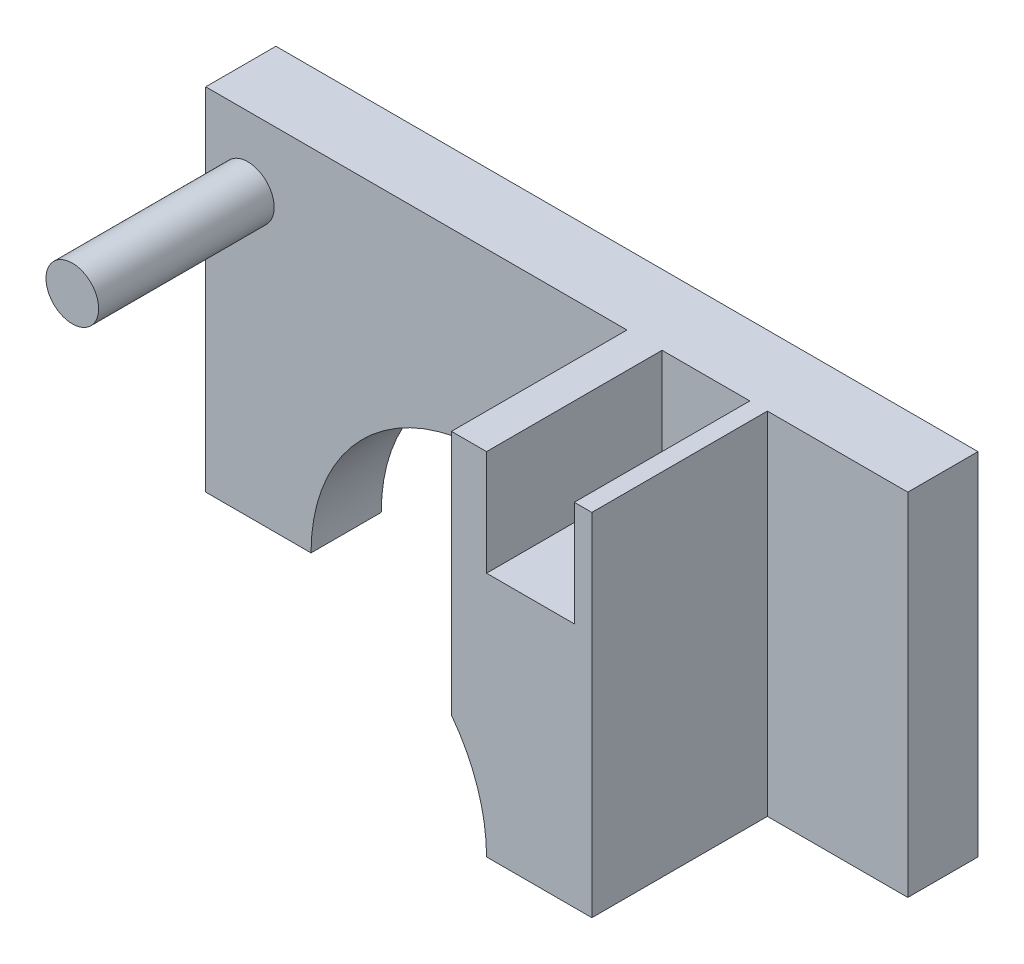
ISO-10303-21;
HEADER;
FILE_DESCRIPTION(('STEP AP214'),'2;1');
FILE_NAME('part.step','',(''),(''),'','','');
FILE_SCHEMA(('AUTOMOTIVE_DESIGN { 1 0 10303 214 1 1 1 1 }'));
ENDSEC;
DATA;
#1=APPLICATION_CONTEXT('core data for automotive mechanical design processes');
#2=APPLICATION_PROTOCOL_DEFINITION('international standard','automotive_design',2000,#1);
#3=PRODUCT_CONTEXT('',#1,'mechanical');
#4=PRODUCT('Part','Part','',(#3));
#5=PRODUCT_RELATED_PRODUCT_CATEGORY('part','',(#4));
#6=PRODUCT_DEFINITION_FORMATION('','',#4);
#7=PRODUCT_DEFINITION_CONTEXT('part definition',#1,'design');
#8=PRODUCT_DEFINITION('design','',#6,#7);
#9=PRODUCT_DEFINITION_SHAPE('','',#8);
#10=(LENGTH_UNIT() NAMED_UNIT(*) SI_UNIT(.MILLI.,.METRE.));
#11=(NAMED_UNIT(*) PLANE_ANGLE_UNIT() SI_UNIT($,.RADIAN.));
#12=(NAMED_UNIT(*) SI_UNIT($,.STERADIAN.) SOLID_ANGLE_UNIT());
#13=UNCERTAINTY_MEASURE_WITH_UNIT(LENGTH_MEASURE(1.E-05),#10,'distance_accuracy_value','');
#14=(GEOMETRIC_REPRESENTATION_CONTEXT(3) GLOBAL_UNCERTAINTY_ASSIGNED_CONTEXT((#13)) GLOBAL_UNIT_ASSIGNED_CONTEXT((#10,
#11,#12)) REPRESENTATION_CONTEXT('',''));
#15=CARTESIAN_POINT('',(0.,0.,0.));
#16=DIRECTION('',(0.,0.,1.));
#17=DIRECTION('',(1.,0.,0.));
#18=AXIS2_PLACEMENT_3D('',#15,#16,#17);
#19=CARTESIAN_POINT('',(0.,0.,20.));
#20=DIRECTION('',(0.,1.,0.));
#21=DIRECTION('',(0.,0.,1.));
#22=AXIS2_PLACEMENT_3D('',#19,#20,#21);
#23=PLANE('',#22);
#24=DIRECTION('',(1.,0.,0.));
#25=VECTOR('',#24,1.);
#26=CARTESIAN_POINT('',(120.,0.,70.));
#27=LINE('',#26,#25);
#28=CARTESIAN_POINT('',(130.,0.,70.));
#29=VERTEX_POINT('',#28);
#30=CARTESIAN_POINT('',(160.,0.,70.));
#31=VERTEX_POINT('',#30);
#32=EDGE_CURVE('E156',#29,#31,#27,.T.);
#33=ORIENTED_EDGE('',*,*,#32,.F.);
#34=DIRECTION('',(0.,0.,-1.));
#35=VECTOR('',#34,1.);
#36=CARTESIAN_POINT('',(130.,0.,211.42135623731));
#37=LINE('',#36,#35);
#38=CARTESIAN_POINT('',(130.,0.,0.));
#39=VERTEX_POINT('',#38);
#40=EDGE_CURVE('E51',#29,#39,#37,.T.);
#41=ORIENTED_EDGE('',*,*,#40,.T.);
#42=DIRECTION('',(1.,0.,0.));
#43=VECTOR('',#42,1.);
#44=CARTESIAN_POINT('',(0.,0.,0.));
#45=LINE('',#44,#43);
#46=CARTESIAN_POINT('',(200.,0.,0.));
#47=VERTEX_POINT('',#46);
#48=EDGE_CURVE('E207',#39,#47,#45,.T.);
#49=ORIENTED_EDGE('',*,*,#48,.T.);
#50=DIRECTION('',(0.,0.,-1.));
#51=VECTOR('',#50,1.);
#52=CARTESIAN_POINT('',(200.,0.,20.));
#53=LINE('',#52,#51);
#54=CARTESIAN_POINT('',(200.,0.,20.));
#55=VERTEX_POINT('',#54);
#56=EDGE_CURVE('E219',#55,#47,#53,.T.);
#57=ORIENTED_EDGE('',*,*,#56,.F.);
#58=DIRECTION('',(1.,0.,0.));
#59=VECTOR('',#58,1.);
#60=CARTESIAN_POINT('',(0.,0.,20.));
#61=LINE('',#60,#59);
#62=CARTESIAN_POINT('',(160.,0.,20.));
#63=VERTEX_POINT('',#62);
#64=EDGE_CURVE('E192',#63,#55,#61,.T.);
#65=ORIENTED_EDGE('',*,*,#64,.F.);
#66=DIRECTION('',(0.,0.,-1.));
#67=VECTOR('',#66,1.);
#68=CARTESIAN_POINT('',(160.,0.,70.));
#69=LINE('',#68,#67);
#70=EDGE_CURVE('E180',#31,#63,#69,.T.);
#71=ORIENTED_EDGE('',*,*,#70,.F.);
#72=EDGE_LOOP('',(#33,#41,#49,#57,#65,#71));
#73=FACE_BOUND('',#72,.T.);
#74=ADVANCED_FACE('F36',(#73),#23,.F.);
#75=CARTESIAN_POINT('',(0.,0.,20.));
#76=DIRECTION('',(0.,0.,-1.));
#77=DIRECTION('',(-1.,0.,0.));
#78=AXIS2_PLACEMENT_3D('',#75,#76,#77);
#79=PLANE('',#78);
#80=DIRECTION('',(0.,1.,0.));
#81=VECTOR('',#80,1.);
#82=CARTESIAN_POINT('',(160.,0.,20.));
#83=LINE('',#82,#81);
#84=CARTESIAN_POINT('',(160.,100.,20.));
#85=VERTEX_POINT('',#84);
#86=EDGE_CURVE('E173',#63,#85,#83,.T.);
#87=ORIENTED_EDGE('',*,*,#86,.F.);
#88=ORIENTED_EDGE('',*,*,#64,.T.);
#89=DIRECTION('',(0.,1.,0.));
#90=VECTOR('',#89,1.);
#91=CARTESIAN_POINT('',(200.,0.,20.));
#92=LINE('',#91,#90);
#93=CARTESIAN_POINT('',(200.,100.,20.));
#94=VERTEX_POINT('',#93);
#95=EDGE_CURVE('E197',#55,#94,#92,.T.);
#96=ORIENTED_EDGE('',*,*,#95,.T.);
#97=DIRECTION('',(-1.,0.,0.));
#98=VECTOR('',#97,1.);
#99=CARTESIAN_POINT('',(0.,100.,20.));
#100=LINE('',#99,#98);
#101=EDGE_CURVE('E200',#94,#85,#100,.T.);
#102=ORIENTED_EDGE('',*,*,#101,.T.);
#103=EDGE_LOOP('',(#87,#88,#96,#102));
#104=FACE_BOUND('',#103,.T.);
#105=ADVANCED_FACE('F292',(#104),#79,.F.);
#106=CARTESIAN_POINT('',(155.,100.,20.));
#107=VERTEX_POINT('',#106);
#108=CARTESIAN_POINT('',(130.,100.,20.));
#109=VERTEX_POINT('',#108);
#110=EDGE_CURVE('E204',#107,#109,#100,.T.);
#111=ORIENTED_EDGE('',*,*,#110,.T.);
#112=DIRECTION('',(0.,-1.,0.));
#113=VECTOR('',#112,1.);
#114=CARTESIAN_POINT('',(130.,100.,20.));
#115=LINE('',#114,#113);
#116=CARTESIAN_POINT('',(130.,70.,20.));
#117=VERTEX_POINT('',#116);
#118=EDGE_CURVE('E164',#109,#117,#115,.T.);
#119=ORIENTED_EDGE('',*,*,#118,.T.);
#120=DIRECTION('',(1.,0.,0.));
#121=VECTOR('',#120,1.);
#122=CARTESIAN_POINT('',(130.,70.,20.));
#123=LINE('',#122,#121);
#124=CARTESIAN_POINT('',(155.,70.,20.));
#125=VERTEX_POINT('',#124);
#126=EDGE_CURVE('E167',#117,#125,#123,.T.);
#127=ORIENTED_EDGE('',*,*,#126,.T.);
#128=DIRECTION('',(0.,-1.,0.));
#129=VECTOR('',#128,1.);
#130=CARTESIAN_POINT('',(155.,100.,20.));
#131=LINE('',#130,#129);
#132=EDGE_CURVE('E170',#107,#125,#131,.T.);
#133=ORIENTED_EDGE('',*,*,#132,.F.);
#134=EDGE_LOOP('',(#111,#119,#127,#133));
#135=FACE_BOUND('',#134,.T.);
#136=ADVANCED_FACE('F281',(#135),#79,.F.);
#137=CARTESIAN_POINT('',(0.,0.,20.));
#138=DIRECTION('',(1.,0.,0.));
#139=DIRECTION('',(0.,0.,-1.));
#140=AXIS2_PLACEMENT_3D('',#137,#138,#139);
#141=PLANE('',#140);
#142=DIRECTION('',(0.,-1.,0.));
#143=VECTOR('',#142,1.);
#144=CARTESIAN_POINT('',(0.,0.,0.));
#145=LINE('',#144,#143);
#146=CARTESIAN_POINT('',(0.,100.,0.));
#147=VERTEX_POINT('',#146);
#148=CARTESIAN_POINT('',(0.,0.,0.));
#149=VERTEX_POINT('',#148);
#150=EDGE_CURVE('E179',#147,#149,#145,.T.);
#151=ORIENTED_EDGE('',*,*,#150,.T.);
#152=DIRECTION('',(0.,0.,-1.));
#153=VECTOR('',#152,1.);
#154=CARTESIAN_POINT('',(0.,0.,20.));
#155=LINE('',#154,#153);
#156=CARTESIAN_POINT('',(0.,0.,20.));
#157=VERTEX_POINT('',#156);
#158=EDGE_CURVE('E44',#157,#149,#155,.T.);
#159=ORIENTED_EDGE('',*,*,#158,.F.);
#160=DIRECTION('',(0.,-1.,0.));
#161=VECTOR('',#160,1.);
#162=CARTESIAN_POINT('',(0.,0.,20.));
#163=LINE('',#162,#161);
#164=CARTESIAN_POINT('',(0.,100.,20.));
#165=VERTEX_POINT('',#164);
#166=EDGE_CURVE('E189',#165,#157,#163,.T.);
#167=ORIENTED_EDGE('',*,*,#166,.F.);
#168=DIRECTION('',(0.,0.,-1.));
#169=VECTOR('',#168,1.);
#170=CARTESIAN_POINT('',(0.,100.,20.));
#171=LINE('',#170,#169);
#172=EDGE_CURVE('E203',#165,#147,#171,.T.);
#173=ORIENTED_EDGE('',*,*,#172,.T.);
#174=EDGE_LOOP('',(#151,#159,#167,#173));
#175=FACE_BOUND('',#174,.T.);
#176=ADVANCED_FACE('F38',(#175),#141,.F.);
#177=CARTESIAN_POINT('',(30.,0.,0.));
#178=VERTEX_POINT('',#177);
#179=EDGE_CURVE('E208',#149,#178,#45,.T.);
#180=ORIENTED_EDGE('',*,*,#179,.T.);
#181=DIRECTION('',(0.,0.,-1.));
#182=VECTOR('',#181,1.);
#183=CARTESIAN_POINT('',(30.,0.,211.42135623731));
#184=LINE('',#183,#182);
#185=CARTESIAN_POINT('',(30.,0.,20.));
#186=VERTEX_POINT('',#185);
#187=EDGE_CURVE('E242',#178,#186,#184,.F.);
#188=ORIENTED_EDGE('',*,*,#187,.T.);
#189=EDGE_CURVE('E194',#157,#186,#61,.T.);
#190=ORIENTED_EDGE('',*,*,#189,.F.);
#191=ORIENTED_EDGE('',*,*,#158,.T.);
#192=EDGE_LOOP('',(#180,#188,#190,#191));
#193=FACE_BOUND('',#192,.T.);
#194=ADVANCED_FACE('F224',(#193),#23,.F.);
#195=CARTESIAN_POINT('',(200.,0.,20.));
#196=DIRECTION('',(-1.,0.,0.));
#197=DIRECTION('',(0.,0.,1.));
#198=AXIS2_PLACEMENT_3D('',#195,#196,#197);
#199=PLANE('',#198);
#200=DIRECTION('',(0.,1.,0.));
#201=VECTOR('',#200,1.);
#202=CARTESIAN_POINT('',(200.,0.,0.));
#203=LINE('',#202,#201);
#204=CARTESIAN_POINT('',(200.,100.,0.));
#205=VERTEX_POINT('',#204);
#206=EDGE_CURVE('E211',#47,#205,#203,.T.);
#207=ORIENTED_EDGE('',*,*,#206,.T.);
#208=DIRECTION('',(0.,0.,-1.));
#209=VECTOR('',#208,1.);
#210=CARTESIAN_POINT('',(200.,100.,20.));
#211=LINE('',#210,#209);
#212=EDGE_CURVE('E216',#94,#205,#211,.T.);
#213=ORIENTED_EDGE('',*,*,#212,.F.);
#214=ORIENTED_EDGE('',*,*,#95,.F.);
#215=ORIENTED_EDGE('',*,*,#56,.T.);
#216=EDGE_LOOP('',(#207,#213,#214,#215));
#217=FACE_BOUND('',#216,.T.);
#218=ADVANCED_FACE('F302',(#217),#199,.F.);
#219=CARTESIAN_POINT('',(0.,100.,20.));
#220=DIRECTION('',(0.,-1.,0.));
#221=DIRECTION('',(0.,0.,-1.));
#222=AXIS2_PLACEMENT_3D('',#219,#220,#221);
#223=PLANE('',#222);
#224=DIRECTION('',(-1.,0.,0.));
#225=VECTOR('',#224,1.);
#226=CARTESIAN_POINT('',(0.,100.,0.));
#227=LINE('',#226,#225);
#228=EDGE_CURVE('E193',#205,#147,#227,.T.);
#229=ORIENTED_EDGE('',*,*,#228,.T.);
#230=ORIENTED_EDGE('',*,*,#172,.F.);
#231=CARTESIAN_POINT('',(120.,100.,20.));
#232=VERTEX_POINT('',#231);
#233=EDGE_CURVE('E199',#232,#165,#100,.T.);
#234=ORIENTED_EDGE('',*,*,#233,.F.);
#235=DIRECTION('',(0.,0.,-1.));
#236=VECTOR('',#235,1.);
#237=CARTESIAN_POINT('',(120.,100.,70.));
#238=LINE('',#237,#236);
#239=CARTESIAN_POINT('',(120.,100.,70.));
#240=VERTEX_POINT('',#239);
#241=EDGE_CURVE('E177',#240,#232,#238,.T.);
#242=ORIENTED_EDGE('',*,*,#241,.F.);
#243=DIRECTION('',(1.,0.,0.));
#244=VECTOR('',#243,1.);
#245=CARTESIAN_POINT('',(120.,100.,70.));
#246=LINE('',#245,#244);
#247=CARTESIAN_POINT('',(130.,100.,70.));
#248=VERTEX_POINT('',#247);
#249=EDGE_CURVE('E154',#240,#248,#246,.T.);
#250=ORIENTED_EDGE('',*,*,#249,.T.);
#251=DIRECTION('',(0.,0.,-1.));
#252=VECTOR('',#251,1.);
#253=CARTESIAN_POINT('',(130.,100.,70.));
#254=LINE('',#253,#252);
#255=EDGE_CURVE('E155',#248,#109,#254,.T.);
#256=ORIENTED_EDGE('',*,*,#255,.T.);
#257=ORIENTED_EDGE('',*,*,#110,.F.);
#258=DIRECTION('',(0.,0.,-1.));
#259=VECTOR('',#258,1.);
#260=CARTESIAN_POINT('',(155.,100.,70.));
#261=LINE('',#260,#259);
#262=CARTESIAN_POINT('',(155.,100.,70.));
#263=VERTEX_POINT('',#262);
#264=EDGE_CURVE('E184',#263,#107,#261,.T.);
#265=ORIENTED_EDGE('',*,*,#264,.F.);
#266=DIRECTION('',(1.,0.,0.));
#267=VECTOR('',#266,1.);
#268=CARTESIAN_POINT('',(155.,100.,70.));
#269=LINE('',#268,#267);
#270=CARTESIAN_POINT('',(160.,100.,70.));
#271=VERTEX_POINT('',#270);
#272=EDGE_CURVE('E254',#263,#271,#269,.T.);
#273=ORIENTED_EDGE('',*,*,#272,.T.);
#274=DIRECTION('',(0.,0.,-1.));
#275=VECTOR('',#274,1.);
#276=CARTESIAN_POINT('',(160.,100.,70.));
#277=LINE('',#276,#275);
#278=EDGE_CURVE('E182',#271,#85,#277,.T.);
#279=ORIENTED_EDGE('',*,*,#278,.T.);
#280=ORIENTED_EDGE('',*,*,#101,.F.);
#281=ORIENTED_EDGE('',*,*,#212,.T.);
#282=EDGE_LOOP('',(#229,#230,#234,#242,#250,#256,#257,#265,#273,#279,#280,#281));
#283=FACE_BOUND('',#282,.T.);
#284=ADVANCED_FACE('F265',(#283),#223,.F.);
#285=CARTESIAN_POINT('',(12.,80.,20.));
#286=DIRECTION('',(0.,0.,-1.));
#287=DIRECTION('',(-1.,0.,0.));
#288=AXIS2_PLACEMENT_3D('',#285,#286,#287);
#289=CIRCLE('',#288,7.5);
#290=CARTESIAN_POINT('',(4.5,80.,20.));
#291=VERTEX_POINT('',#290);
#292=EDGE_CURVE('E11',#291,#291,#289,.F.);
#293=ORIENTED_EDGE('',*,*,#292,.F.);
#294=EDGE_LOOP('',(#293));
#295=FACE_BOUND('',#294,.T.);
#296=ORIENTED_EDGE('',*,*,#189,.T.);
#297=CARTESIAN_POINT('',(80.,0.,20.));
#298=DIRECTION('',(0.,0.,-1.));
#299=DIRECTION('',(-1.,0.,0.));
#300=AXIS2_PLACEMENT_3D('',#297,#298,#299);
#301=CIRCLE('',#300,50.);
#302=CARTESIAN_POINT('',(120.,30.,20.));
#303=VERTEX_POINT('',#302);
#304=EDGE_CURVE('E148',#186,#303,#301,.T.);
#305=ORIENTED_EDGE('',*,*,#304,.T.);
#306=DIRECTION('',(0.,1.,0.));
#307=VECTOR('',#306,1.);
#308=CARTESIAN_POINT('',(120.,0.,20.));
#309=LINE('',#308,#307);
#310=EDGE_CURVE('E59',#303,#232,#309,.T.);
#311=ORIENTED_EDGE('',*,*,#310,.T.);
#312=ORIENTED_EDGE('',*,*,#233,.T.);
#313=ORIENTED_EDGE('',*,*,#166,.T.);
#314=EDGE_LOOP('',(#296,#305,#311,#312,#313));
#315=FACE_BOUND('',#314,.T.);
#316=ADVANCED_FACE('F299',(#295,#315),#79,.F.);
#317=CARTESIAN_POINT('',(0.,0.,0.));
#318=DIRECTION('',(0.,0.,-1.));
#319=DIRECTION('',(-1.,0.,0.));
#320=AXIS2_PLACEMENT_3D('',#317,#318,#319);
#321=PLANE('',#320);
#322=CARTESIAN_POINT('',(80.,0.,0.));
#323=DIRECTION('',(0.,0.,-1.));
#324=DIRECTION('',(-1.,0.,0.));
#325=AXIS2_PLACEMENT_3D('',#322,#323,#324);
#326=CIRCLE('',#325,50.);
#327=EDGE_CURVE('E142',#178,#39,#326,.T.);
#328=ORIENTED_EDGE('',*,*,#327,.F.);
#329=ORIENTED_EDGE('',*,*,#179,.F.);
#330=ORIENTED_EDGE('',*,*,#150,.F.);
#331=ORIENTED_EDGE('',*,*,#228,.F.);
#332=ORIENTED_EDGE('',*,*,#206,.F.);
#333=ORIENTED_EDGE('',*,*,#48,.F.);
#334=EDGE_LOOP('',(#328,#329,#330,#331,#332,#333));
#335=FACE_BOUND('',#334,.T.);
#336=ADVANCED_FACE('F233',(#335),#321,.T.);
#337=CARTESIAN_POINT('',(120.,0.,70.));
#338=DIRECTION('',(-1.,0.,0.));
#339=DIRECTION('',(0.,0.,1.));
#340=AXIS2_PLACEMENT_3D('',#337,#338,#339);
#341=PLANE('',#340);
#342=DIRECTION('',(0.,0.,-1.));
#343=VECTOR('',#342,1.);
#344=CARTESIAN_POINT('',(120.,30.,211.42135623731));
#345=LINE('',#344,#343);
#346=CARTESIAN_POINT('',(120.,30.,70.));
#347=VERTEX_POINT('',#346);
#348=EDGE_CURVE('E138',#347,#303,#345,.T.);
#349=ORIENTED_EDGE('',*,*,#348,.F.);
#350=DIRECTION('',(0.,1.,0.));
#351=VECTOR('',#350,1.);
#352=CARTESIAN_POINT('',(120.,0.,70.));
#353=LINE('',#352,#351);
#354=EDGE_CURVE('E146',#347,#240,#353,.T.);
#355=ORIENTED_EDGE('',*,*,#354,.T.);
#356=ORIENTED_EDGE('',*,*,#241,.T.);
#357=ORIENTED_EDGE('',*,*,#310,.F.);
#358=EDGE_LOOP('',(#349,#355,#356,#357));
#359=FACE_BOUND('',#358,.T.);
#360=ADVANCED_FACE('F145',(#359),#341,.T.);
#361=CARTESIAN_POINT('',(160.,0.,70.));
#362=DIRECTION('',(-1.,0.,0.));
#363=DIRECTION('',(0.,0.,1.));
#364=AXIS2_PLACEMENT_3D('',#361,#362,#363);
#365=PLANE('',#364);
#366=ORIENTED_EDGE('',*,*,#86,.T.);
#367=ORIENTED_EDGE('',*,*,#278,.F.);
#368=DIRECTION('',(0.,1.,0.));
#369=VECTOR('',#368,1.);
#370=CARTESIAN_POINT('',(160.,0.,70.));
#371=LINE('',#370,#369);
#372=EDGE_CURVE('E160',#31,#271,#371,.T.);
#373=ORIENTED_EDGE('',*,*,#372,.F.);
#374=ORIENTED_EDGE('',*,*,#70,.T.);
#375=EDGE_LOOP('',(#366,#367,#373,#374));
#376=FACE_BOUND('',#375,.T.);
#377=ADVANCED_FACE('F261',(#376),#365,.F.);
#378=CARTESIAN_POINT('',(155.,100.,70.));
#379=DIRECTION('',(1.,0.,0.));
#380=DIRECTION('',(0.,0.,-1.));
#381=AXIS2_PLACEMENT_3D('',#378,#379,#380);
#382=PLANE('',#381);
#383=ORIENTED_EDGE('',*,*,#132,.T.);
#384=DIRECTION('',(0.,0.,-1.));
#385=VECTOR('',#384,1.);
#386=CARTESIAN_POINT('',(155.,70.,70.));
#387=LINE('',#386,#385);
#388=CARTESIAN_POINT('',(155.,70.,70.));
#389=VERTEX_POINT('',#388);
#390=EDGE_CURVE('E186',#389,#125,#387,.T.);
#391=ORIENTED_EDGE('',*,*,#390,.F.);
#392=DIRECTION('',(0.,-1.,0.));
#393=VECTOR('',#392,1.);
#394=CARTESIAN_POINT('',(155.,100.,70.));
#395=LINE('',#394,#393);
#396=EDGE_CURVE('E252',#263,#389,#395,.T.);
#397=ORIENTED_EDGE('',*,*,#396,.F.);
#398=ORIENTED_EDGE('',*,*,#264,.T.);
#399=EDGE_LOOP('',(#383,#391,#397,#398));
#400=FACE_BOUND('',#399,.T.);
#401=ADVANCED_FACE('F272',(#400),#382,.F.);
#402=CARTESIAN_POINT('',(130.,70.,70.));
#403=DIRECTION('',(0.,1.,0.));
#404=DIRECTION('',(0.,0.,1.));
#405=AXIS2_PLACEMENT_3D('',#402,#403,#404);
#406=PLANE('',#405);
#407=ORIENTED_EDGE('',*,*,#126,.F.);
#408=DIRECTION('',(0.,0.,-1.));
#409=VECTOR('',#408,1.);
#410=CARTESIAN_POINT('',(130.,70.,70.));
#411=LINE('',#410,#409);
#412=CARTESIAN_POINT('',(130.,70.,70.));
#413=VERTEX_POINT('',#412);
#414=EDGE_CURVE('E158',#413,#117,#411,.T.);
#415=ORIENTED_EDGE('',*,*,#414,.F.);
#416=DIRECTION('',(1.,0.,0.));
#417=VECTOR('',#416,1.);
#418=CARTESIAN_POINT('',(130.,70.,70.));
#419=LINE('',#418,#417);
#420=EDGE_CURVE('E249',#413,#389,#419,.T.);
#421=ORIENTED_EDGE('',*,*,#420,.T.);
#422=ORIENTED_EDGE('',*,*,#390,.T.);
#423=EDGE_LOOP('',(#407,#415,#421,#422));
#424=FACE_BOUND('',#423,.T.);
#425=ADVANCED_FACE('F282',(#424),#406,.T.);
#426=CARTESIAN_POINT('',(130.,100.,70.));
#427=DIRECTION('',(1.,0.,0.));
#428=DIRECTION('',(0.,0.,-1.));
#429=AXIS2_PLACEMENT_3D('',#426,#427,#428);
#430=PLANE('',#429);
#431=ORIENTED_EDGE('',*,*,#118,.F.);
#432=ORIENTED_EDGE('',*,*,#255,.F.);
#433=DIRECTION('',(0.,-1.,0.));
#434=VECTOR('',#433,1.);
#435=CARTESIAN_POINT('',(130.,100.,70.));
#436=LINE('',#435,#434);
#437=EDGE_CURVE('E246',#248,#413,#436,.T.);
#438=ORIENTED_EDGE('',*,*,#437,.T.);
#439=ORIENTED_EDGE('',*,*,#414,.T.);
#440=EDGE_LOOP('',(#431,#432,#438,#439));
#441=FACE_BOUND('',#440,.T.);
#442=ADVANCED_FACE('F277',(#441),#430,.T.);
#443=CARTESIAN_POINT('',(0.,0.,70.));
#444=DIRECTION('',(0.,0.,-1.));
#445=DIRECTION('',(-1.,0.,0.));
#446=AXIS2_PLACEMENT_3D('',#443,#444,#445);
#447=PLANE('',#446);
#448=ORIENTED_EDGE('',*,*,#354,.F.);
#449=CARTESIAN_POINT('',(80.,0.,70.));
#450=DIRECTION('',(0.,0.,-1.));
#451=DIRECTION('',(-1.,0.,0.));
#452=AXIS2_PLACEMENT_3D('',#449,#450,#451);
#453=CIRCLE('',#452,50.);
#454=EDGE_CURVE('E135',#29,#347,#453,.F.);
#455=ORIENTED_EDGE('',*,*,#454,.F.);
#456=ORIENTED_EDGE('',*,*,#32,.T.);
#457=ORIENTED_EDGE('',*,*,#372,.T.);
#458=ORIENTED_EDGE('',*,*,#272,.F.);
#459=ORIENTED_EDGE('',*,*,#396,.T.);
#460=ORIENTED_EDGE('',*,*,#420,.F.);
#461=ORIENTED_EDGE('',*,*,#437,.F.);
#462=ORIENTED_EDGE('',*,*,#249,.F.);
#463=EDGE_LOOP('',(#448,#455,#456,#457,#458,#459,#460,#461,#462));
#464=FACE_BOUND('',#463,.T.);
#465=ADVANCED_FACE('F151',(#464),#447,.F.);
#466=CARTESIAN_POINT('',(80.,0.,211.42135623731));
#467=DIRECTION('',(0.,0.,-1.));
#468=DIRECTION('',(-1.,0.,0.));
#469=AXIS2_PLACEMENT_3D('',#466,#467,#468);
#470=CYLINDRICAL_SURFACE('',#469,50.);
#471=ORIENTED_EDGE('',*,*,#454,.T.);
#472=ORIENTED_EDGE('',*,*,#348,.T.);
#473=ORIENTED_EDGE('',*,*,#304,.F.);
#474=ORIENTED_EDGE('',*,*,#187,.F.);
#475=ORIENTED_EDGE('',*,*,#327,.T.);
#476=ORIENTED_EDGE('',*,*,#40,.F.);
#477=EDGE_LOOP('',(#471,#472,#473,#474,#475,#476));
#478=FACE_BOUND('',#477,.T.);
#479=ADVANCED_FACE('F137',(#478),#470,.F.);
#480=CARTESIAN_POINT('',(12.,80.,70.));
#481=DIRECTION('',(0.,0.,-1.));
#482=DIRECTION('',(-1.,0.,0.));
#483=AXIS2_PLACEMENT_3D('',#480,#481,#482);
#484=CYLINDRICAL_SURFACE('',#483,7.5);
#485=CARTESIAN_POINT('',(12.,80.,70.));
#486=DIRECTION('',(0.,0.,1.));
#487=DIRECTION('',(1.,0.,0.));
#488=AXIS2_PLACEMENT_3D('',#485,#486,#487);
#489=CIRCLE('',#488,7.5);
#490=CARTESIAN_POINT('',(4.5,80.,70.));
#491=VERTEX_POINT('',#490);
#492=EDGE_CURVE('E236',#491,#491,#489,.T.);
#493=CARTESIAN_POINT('',(4.5,80.,70.));
#494=CARTESIAN_POINT('',(4.5,80.,69.4791666666667));
#495=CARTESIAN_POINT('',(4.5,80.,68.9583333333333));
#496=CARTESIAN_POINT('',(4.5,80.,67.9166666666667));
#497=CARTESIAN_POINT('',(4.5,80.,67.3958333333333));
#498=CARTESIAN_POINT('',(4.5,80.,66.3541666666667));
#499=CARTESIAN_POINT('',(4.5,80.,65.8333333333333));
#500=CARTESIAN_POINT('',(4.5,80.,64.7916666666667));
#501=CARTESIAN_POINT('',(4.5,80.,64.2708333333333));
#502=CARTESIAN_POINT('',(4.5,80.,63.2291666666667));
#503=CARTESIAN_POINT('',(4.5,80.,62.7083333333333));
#504=CARTESIAN_POINT('',(4.5,80.,61.6666666666667));
#505=CARTESIAN_POINT('',(4.5,80.,61.1458333333333));
#506=CARTESIAN_POINT('',(4.5,80.,60.1041666666667));
#507=CARTESIAN_POINT('',(4.5,80.,59.5833333333333));
#508=CARTESIAN_POINT('',(4.5,80.,58.5416666666667));
#509=CARTESIAN_POINT('',(4.5,80.,58.0208333333333));
#510=CARTESIAN_POINT('',(4.5,80.,56.9791666666667));
#511=CARTESIAN_POINT('',(4.5,80.,56.4583333333333));
#512=CARTESIAN_POINT('',(4.5,80.,55.4166666666667));
#513=CARTESIAN_POINT('',(4.5,80.,54.8958333333333));
#514=CARTESIAN_POINT('',(4.5,80.,53.8541666666667));
#515=CARTESIAN_POINT('',(4.5,80.,53.3333333333333));
#516=CARTESIAN_POINT('',(4.5,80.,52.2916666666667));
#517=CARTESIAN_POINT('',(4.5,80.,51.7708333333333));
#518=CARTESIAN_POINT('',(4.5,80.,50.7291666666667));
#519=CARTESIAN_POINT('',(4.5,80.,50.2083333333333));
#520=CARTESIAN_POINT('',(4.5,80.,49.1666666666667));
#521=CARTESIAN_POINT('',(4.5,80.,48.6458333333333));
#522=CARTESIAN_POINT('',(4.5,80.,47.6041666666667));
#523=CARTESIAN_POINT('',(4.5,80.,47.0833333333333));
#524=CARTESIAN_POINT('',(4.5,80.,46.0416666666667));
#525=CARTESIAN_POINT('',(4.5,80.,45.5208333333333));
#526=CARTESIAN_POINT('',(4.5,80.,44.4791666666667));
#527=CARTESIAN_POINT('',(4.5,80.,43.9583333333333));
#528=CARTESIAN_POINT('',(4.5,80.,42.9166666666667));
#529=CARTESIAN_POINT('',(4.5,80.,42.3958333333333));
#530=CARTESIAN_POINT('',(4.5,80.,41.3541666666667));
#531=CARTESIAN_POINT('',(4.5,80.,40.8333333333333));
#532=CARTESIAN_POINT('',(4.5,80.,39.7916666666667));
#533=CARTESIAN_POINT('',(4.5,80.,39.2708333333333));
#534=CARTESIAN_POINT('',(4.5,80.,38.2291666666667));
#535=CARTESIAN_POINT('',(4.5,80.,37.7083333333333));
#536=CARTESIAN_POINT('',(4.5,80.,36.6666666666667));
#537=CARTESIAN_POINT('',(4.5,80.,36.1458333333333));
#538=CARTESIAN_POINT('',(4.5,80.,35.1041666666667));
#539=CARTESIAN_POINT('',(4.5,80.,34.5833333333333));
#540=CARTESIAN_POINT('',(4.5,80.,33.5416666666667));
#541=CARTESIAN_POINT('',(4.5,80.,33.0208333333333));
#542=CARTESIAN_POINT('',(4.5,80.,31.9791666666667));
#543=CARTESIAN_POINT('',(4.5,80.,31.4583333333333));
#544=CARTESIAN_POINT('',(4.5,80.,30.4166666666667));
#545=CARTESIAN_POINT('',(4.5,80.,29.8958333333333));
#546=CARTESIAN_POINT('',(4.5,80.,28.8541666666667));
#547=CARTESIAN_POINT('',(4.5,80.,28.3333333333333));
#548=CARTESIAN_POINT('',(4.5,80.,27.2916666666667));
#549=CARTESIAN_POINT('',(4.5,80.,26.7708333333333));
#550=CARTESIAN_POINT('',(4.5,80.,25.7291666666667));
#551=CARTESIAN_POINT('',(4.5,80.,25.2083333333333));
#552=CARTESIAN_POINT('',(4.5,80.,24.1666666666667));
#553=CARTESIAN_POINT('',(4.5,80.,23.6458333333333));
#554=CARTESIAN_POINT('',(4.5,80.,22.6041666666667));
#555=CARTESIAN_POINT('',(4.5,80.,22.0833333333333));
#556=CARTESIAN_POINT('',(4.5,80.,21.0416666666667));
#557=CARTESIAN_POINT('',(4.5,80.,20.5208333333333));
#558=CARTESIAN_POINT('',(4.5,80.,20.));
#559=B_SPLINE_CURVE_WITH_KNOTS('',3,(#493,#494,#495,#496,#497,#498,#499,#500,#501,#502,#503,
#504,#505,#506,#507,#508,#509,#510,#511,#512,#513,#514,#515,#516,#517,#518,#519,#520,#521,#522,
#523,#524,#525,#526,#527,#528,#529,#530,#531,#532,#533,#534,#535,#536,#537,#538,#539,#540,#541,
#542,#543,#544,#545,#546,#547,#548,#549,#550,#551,#552,#553,#554,#555,#556,#557,#558),
.UNSPECIFIED.,.F.,.F.,(4,2,2,2,2,2,2,2,2,2,2,2,2,2,2,2,2,2,2,2,2,2,2,2,2,2,2,2,2,2,2,2,4),(0.,
1.56249999999999,3.12499999999999,4.6875,6.24999999999999,7.81249999999999,9.37499999999999,
10.9375,12.5,14.0625,15.625,17.1875,18.75,20.3125,21.875,23.4375,25.,26.5625,28.125,29.6875,
31.25,32.8125,34.375,35.9375,37.5,39.0625,40.625,42.1875,43.75,45.3125,46.875,48.4375,50.),.UNSPECIFIED.);
#560=EDGE_CURVE('BSEAM323',#491,#291,#559,.T.);
#561=ORIENTED_EDGE('',*,*,#492,.F.);
#562=ORIENTED_EDGE('',*,*,#292,.T.);
#563=ORIENTED_EDGE('',*,*,#560,.T.);
#564=ORIENTED_EDGE('',*,*,#560,.F.);
#565=EDGE_LOOP('',(#561,#563,#562,#564));
#566=FACE_BOUND('',#565,.T.);
#567=ADVANCED_FACE('F323',(#566),#484,.T.);
#568=CARTESIAN_POINT('',(12.,80.,70.));
#569=DIRECTION('',(0.,0.,1.));
#570=DIRECTION('',(1.,0.,0.));
#571=AXIS2_PLACEMENT_3D('',#568,#569,#570);
#572=PLANE('',#571);
#573=ORIENTED_EDGE('',*,*,#492,.T.);
#574=EDGE_LOOP('',(#573));
#575=FACE_BOUND('',#574,.T.);
#576=ADVANCED_FACE('F325',(#575),#572,.T.);
#577=CLOSED_SHELL('',(#74,#105,#136,#176,#194,#218,#284,#316,#336,#360,#377,#401,#425,#442,#465,
#479,#567,#576));
#578=MANIFOLD_SOLID_BREP('B2',#577);
#579=ADVANCED_BREP_SHAPE_REPRESENTATION('',(#18,#578),#14);
#580=SHAPE_DEFINITION_REPRESENTATION(#9,#579);
ENDSEC;
END-ISO-10303-21;
